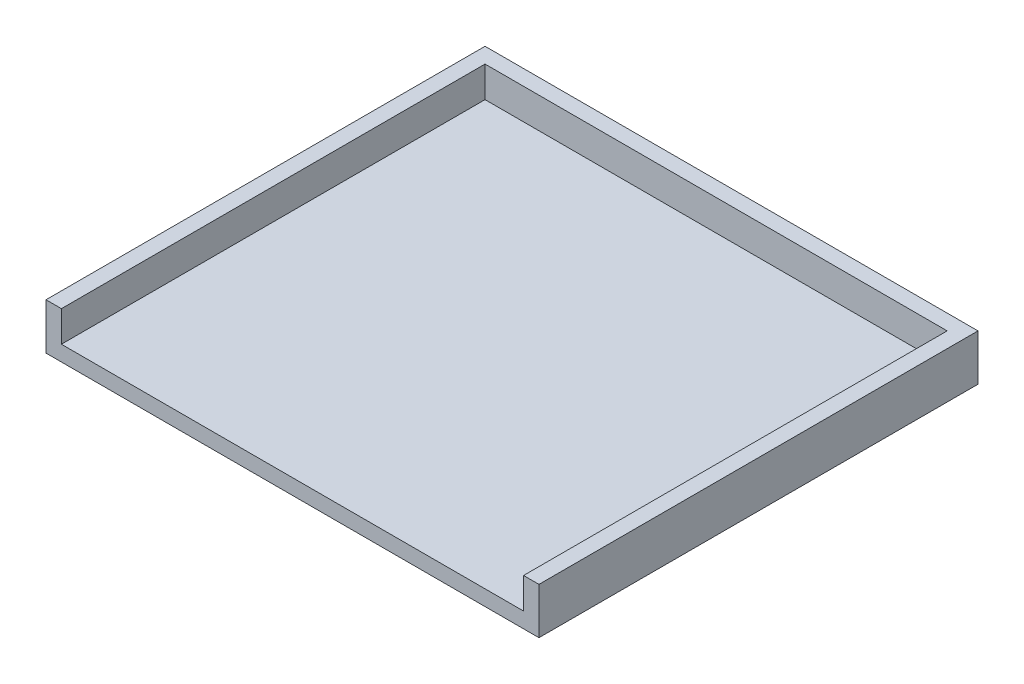
ISO-10303-21;
HEADER;
FILE_DESCRIPTION(('STEP AP214'),'2;1');
FILE_NAME('part.step','',(''),(''),'','','');
FILE_SCHEMA(('AUTOMOTIVE_DESIGN { 1 0 10303 214 1 1 1 1 }'));
ENDSEC;
DATA;
#1=APPLICATION_CONTEXT('core data for automotive mechanical design processes');
#2=APPLICATION_PROTOCOL_DEFINITION('international standard','automotive_design',2000,#1);
#3=PRODUCT_CONTEXT('',#1,'mechanical');
#4=PRODUCT('Part','Part','',(#3));
#5=PRODUCT_RELATED_PRODUCT_CATEGORY('part','',(#4));
#6=PRODUCT_DEFINITION_FORMATION('','',#4);
#7=PRODUCT_DEFINITION_CONTEXT('part definition',#1,'design');
#8=PRODUCT_DEFINITION('design','',#6,#7);
#9=PRODUCT_DEFINITION_SHAPE('','',#8);
#10=(LENGTH_UNIT() NAMED_UNIT(*) SI_UNIT(.MILLI.,.METRE.));
#11=(NAMED_UNIT(*) PLANE_ANGLE_UNIT() SI_UNIT($,.RADIAN.));
#12=(NAMED_UNIT(*) SI_UNIT($,.STERADIAN.) SOLID_ANGLE_UNIT());
#13=UNCERTAINTY_MEASURE_WITH_UNIT(LENGTH_MEASURE(1.E-05),#10,'distance_accuracy_value','');
#14=(GEOMETRIC_REPRESENTATION_CONTEXT(3) GLOBAL_UNCERTAINTY_ASSIGNED_CONTEXT((#13)) GLOBAL_UNIT_ASSIGNED_CONTEXT((#10,
#11,#12)) REPRESENTATION_CONTEXT('',''));
#15=CARTESIAN_POINT('',(0.,0.,0.));
#16=DIRECTION('',(0.,0.,1.));
#17=DIRECTION('',(1.,0.,0.));
#18=AXIS2_PLACEMENT_3D('',#15,#16,#17);
#19=CARTESIAN_POINT('',(0.,40.,0.));
#20=DIRECTION('',(0.,1.,0.));
#21=DIRECTION('',(0.,0.,1.));
#22=AXIS2_PLACEMENT_3D('',#19,#20,#21);
#23=PLANE('',#22);
#24=DIRECTION('',(0.,0.,1.));
#25=VECTOR('',#24,1.);
#26=CARTESIAN_POINT('',(1240.,40.,0.));
#27=LINE('',#26,#25);
#28=CARTESIAN_POINT('',(1240.,40.,40.0000000000001));
#29=VERTEX_POINT('',#28);
#30=CARTESIAN_POINT('',(1240.,40.,1140.));
#31=VERTEX_POINT('',#30);
#32=EDGE_CURVE('E135',#29,#31,#27,.T.);
#33=ORIENTED_EDGE('',*,*,#32,.F.);
#34=DIRECTION('',(1.,0.,0.));
#35=VECTOR('',#34,1.);
#36=CARTESIAN_POINT('',(40.,40.,40.0000000000001));
#37=LINE('',#36,#35);
#38=CARTESIAN_POINT('',(40.,40.,40.0000000000001));
#39=VERTEX_POINT('',#38);
#40=EDGE_CURVE('E119',#39,#29,#37,.T.);
#41=ORIENTED_EDGE('',*,*,#40,.F.);
#42=DIRECTION('',(0.,0.,-1.));
#43=VECTOR('',#42,1.);
#44=CARTESIAN_POINT('',(40.,40.,1.2176416873608E-13));
#45=LINE('',#44,#43);
#46=CARTESIAN_POINT('',(40.,40.,1140.));
#47=VERTEX_POINT('',#46);
#48=EDGE_CURVE('E123',#47,#39,#45,.T.);
#49=ORIENTED_EDGE('',*,*,#48,.F.);
#50=DIRECTION('',(1.,0.,0.));
#51=VECTOR('',#50,1.);
#52=CARTESIAN_POINT('',(0.,40.,1140.));
#53=LINE('',#52,#51);
#54=EDGE_CURVE('E163',#47,#31,#53,.T.);
#55=ORIENTED_EDGE('',*,*,#54,.T.);
#56=EDGE_LOOP('',(#33,#41,#49,#55));
#57=FACE_BOUND('',#56,.T.);
#58=ADVANCED_FACE('F39',(#57),#23,.T.);
#59=CARTESIAN_POINT('',(1240.,120.,0.));
#60=DIRECTION('',(1.,0.,0.));
#61=DIRECTION('',(0.,0.,-1.));
#62=AXIS2_PLACEMENT_3D('',#59,#60,#61);
#63=PLANE('',#62);
#64=DIRECTION('',(0.,-1.,0.));
#65=VECTOR('',#64,1.);
#66=CARTESIAN_POINT('',(1240.,120.,40.0000000000001));
#67=LINE('',#66,#65);
#68=CARTESIAN_POINT('',(1240.,120.,40.0000000000001));
#69=VERTEX_POINT('',#68);
#70=EDGE_CURVE('E114',#69,#29,#67,.T.);
#71=ORIENTED_EDGE('',*,*,#70,.T.);
#72=ORIENTED_EDGE('',*,*,#32,.T.);
#73=DIRECTION('',(0.,-1.,0.));
#74=VECTOR('',#73,1.);
#75=CARTESIAN_POINT('',(1240.,120.,1140.));
#76=LINE('',#75,#74);
#77=CARTESIAN_POINT('',(1240.,120.,1140.));
#78=VERTEX_POINT('',#77);
#79=EDGE_CURVE('E156',#78,#31,#76,.T.);
#80=ORIENTED_EDGE('',*,*,#79,.F.);
#81=DIRECTION('',(0.,0.,1.));
#82=VECTOR('',#81,1.);
#83=CARTESIAN_POINT('',(1240.,120.,0.));
#84=LINE('',#83,#82);
#85=EDGE_CURVE('E149',#69,#78,#84,.T.);
#86=ORIENTED_EDGE('',*,*,#85,.F.);
#87=EDGE_LOOP('',(#71,#72,#80,#86));
#88=FACE_BOUND('',#87,.T.);
#89=ADVANCED_FACE('F202',(#88),#63,.F.);
#90=CARTESIAN_POINT('',(40.,120.,1.2176416873608E-13));
#91=DIRECTION('',(-1.,0.,0.));
#92=DIRECTION('',(0.,0.,1.));
#93=AXIS2_PLACEMENT_3D('',#90,#91,#92);
#94=PLANE('',#93);
#95=DIRECTION('',(0.,-1.,0.));
#96=VECTOR('',#95,1.);
#97=CARTESIAN_POINT('',(40.,120.,40.0000000000001));
#98=LINE('',#97,#96);
#99=CARTESIAN_POINT('',(40.,120.,40.0000000000001));
#100=VERTEX_POINT('',#99);
#101=EDGE_CURVE('E111',#100,#39,#98,.T.);
#102=ORIENTED_EDGE('',*,*,#101,.F.);
#103=DIRECTION('',(0.,0.,-1.));
#104=VECTOR('',#103,1.);
#105=CARTESIAN_POINT('',(40.,120.,1.2176416873608E-13));
#106=LINE('',#105,#104);
#107=CARTESIAN_POINT('',(40.,120.,1140.));
#108=VERTEX_POINT('',#107);
#109=EDGE_CURVE('E122',#108,#100,#106,.T.);
#110=ORIENTED_EDGE('',*,*,#109,.F.);
#111=DIRECTION('',(0.,-1.,0.));
#112=VECTOR('',#111,1.);
#113=CARTESIAN_POINT('',(40.,120.,1140.));
#114=LINE('',#113,#112);
#115=EDGE_CURVE('E55',#108,#47,#114,.T.);
#116=ORIENTED_EDGE('',*,*,#115,.T.);
#117=ORIENTED_EDGE('',*,*,#48,.T.);
#118=EDGE_LOOP('',(#102,#110,#116,#117));
#119=FACE_BOUND('',#118,.T.);
#120=ADVANCED_FACE('F121',(#119),#94,.F.);
#121=CARTESIAN_POINT('',(0.,40.,0.));
#122=DIRECTION('',(1.,0.,0.));
#123=DIRECTION('',(0.,0.,-1.));
#124=AXIS2_PLACEMENT_3D('',#121,#122,#123);
#125=PLANE('',#124);
#126=DIRECTION('',(0.,0.,1.));
#127=VECTOR('',#126,1.);
#128=CARTESIAN_POINT('',(0.,0.,0.));
#129=LINE('',#128,#127);
#130=CARTESIAN_POINT('',(0.,0.,0.));
#131=VERTEX_POINT('',#130);
#132=CARTESIAN_POINT('',(0.,0.,1140.));
#133=VERTEX_POINT('',#132);
#134=EDGE_CURVE('E162',#131,#133,#129,.T.);
#135=ORIENTED_EDGE('',*,*,#134,.T.);
#136=DIRECTION('',(0.,-1.,0.));
#137=VECTOR('',#136,1.);
#138=CARTESIAN_POINT('',(0.,40.,1140.));
#139=LINE('',#138,#137);
#140=CARTESIAN_POINT('',(2.22044604925031E-13,120.,1140.));
#141=VERTEX_POINT('',#140);
#142=EDGE_CURVE('E11',#141,#133,#139,.T.);
#143=ORIENTED_EDGE('',*,*,#142,.F.);
#144=DIRECTION('',(0.,0.,1.));
#145=VECTOR('',#144,1.);
#146=CARTESIAN_POINT('',(0.,120.,1.2465662030879E-13));
#147=LINE('',#146,#145);
#148=CARTESIAN_POINT('',(0.,120.,1.2465662030879E-13));
#149=VERTEX_POINT('',#148);
#150=EDGE_CURVE('E137',#149,#141,#147,.T.);
#151=ORIENTED_EDGE('',*,*,#150,.F.);
#152=DIRECTION('',(0.,-1.,0.));
#153=VECTOR('',#152,1.);
#154=CARTESIAN_POINT('',(0.,40.,0.));
#155=LINE('',#154,#153);
#156=EDGE_CURVE('E167',#149,#131,#155,.T.);
#157=ORIENTED_EDGE('',*,*,#156,.T.);
#158=EDGE_LOOP('',(#135,#143,#151,#157));
#159=FACE_BOUND('',#158,.T.);
#160=ADVANCED_FACE('F41',(#159),#125,.F.);
#161=CARTESIAN_POINT('',(0.,40.,1140.));
#162=DIRECTION('',(0.,0.,-1.));
#163=DIRECTION('',(-1.,0.,0.));
#164=AXIS2_PLACEMENT_3D('',#161,#162,#163);
#165=PLANE('',#164);
#166=DIRECTION('',(1.,0.,0.));
#167=VECTOR('',#166,1.);
#168=CARTESIAN_POINT('',(0.,0.,1140.));
#169=LINE('',#168,#167);
#170=CARTESIAN_POINT('',(1280.,0.,1140.));
#171=VERTEX_POINT('',#170);
#172=EDGE_CURVE('E171',#133,#171,#169,.T.);
#173=ORIENTED_EDGE('',*,*,#172,.T.);
#174=DIRECTION('',(0.,-1.,0.));
#175=VECTOR('',#174,1.);
#176=CARTESIAN_POINT('',(1280.,40.,1140.));
#177=LINE('',#176,#175);
#178=CARTESIAN_POINT('',(1280.,120.,1140.));
#179=VERTEX_POINT('',#178);
#180=EDGE_CURVE('E48',#179,#171,#177,.T.);
#181=ORIENTED_EDGE('',*,*,#180,.F.);
#182=DIRECTION('',(1.,0.,0.));
#183=VECTOR('',#182,1.);
#184=CARTESIAN_POINT('',(1280.,120.,1140.));
#185=LINE('',#184,#183);
#186=EDGE_CURVE('E152',#78,#179,#185,.T.);
#187=ORIENTED_EDGE('',*,*,#186,.F.);
#188=ORIENTED_EDGE('',*,*,#79,.T.);
#189=ORIENTED_EDGE('',*,*,#54,.F.);
#190=ORIENTED_EDGE('',*,*,#115,.F.);
#191=DIRECTION('',(1.,0.,0.));
#192=VECTOR('',#191,1.);
#193=CARTESIAN_POINT('',(2.22044604925031E-13,120.,1140.));
#194=LINE('',#193,#192);
#195=EDGE_CURVE('E130',#141,#108,#194,.T.);
#196=ORIENTED_EDGE('',*,*,#195,.F.);
#197=ORIENTED_EDGE('',*,*,#142,.T.);
#198=EDGE_LOOP('',(#173,#181,#187,#188,#189,#190,#196,#197));
#199=FACE_BOUND('',#198,.T.);
#200=ADVANCED_FACE('F199',(#199),#165,.F.);
#201=CARTESIAN_POINT('',(1280.,40.,0.));
#202=DIRECTION('',(-1.,0.,0.));
#203=DIRECTION('',(0.,0.,1.));
#204=AXIS2_PLACEMENT_3D('',#201,#202,#203);
#205=PLANE('',#204);
#206=DIRECTION('',(0.,0.,-1.));
#207=VECTOR('',#206,1.);
#208=CARTESIAN_POINT('',(1280.,0.,0.));
#209=LINE('',#208,#207);
#210=CARTESIAN_POINT('',(1280.,0.,0.));
#211=VERTEX_POINT('',#210);
#212=EDGE_CURVE('E174',#171,#211,#209,.T.);
#213=ORIENTED_EDGE('',*,*,#212,.T.);
#214=DIRECTION('',(0.,-1.,0.));
#215=VECTOR('',#214,1.);
#216=CARTESIAN_POINT('',(1280.,40.,0.));
#217=LINE('',#216,#215);
#218=CARTESIAN_POINT('',(1280.,120.,0.));
#219=VERTEX_POINT('',#218);
#220=EDGE_CURVE('E181',#219,#211,#217,.T.);
#221=ORIENTED_EDGE('',*,*,#220,.F.);
#222=DIRECTION('',(0.,0.,-1.));
#223=VECTOR('',#222,1.);
#224=CARTESIAN_POINT('',(1280.,120.,0.));
#225=LINE('',#224,#223);
#226=EDGE_CURVE('E143',#179,#219,#225,.T.);
#227=ORIENTED_EDGE('',*,*,#226,.F.);
#228=ORIENTED_EDGE('',*,*,#180,.T.);
#229=EDGE_LOOP('',(#213,#221,#227,#228));
#230=FACE_BOUND('',#229,.T.);
#231=ADVANCED_FACE('F188',(#230),#205,.F.);
#232=CARTESIAN_POINT('',(0.,40.,0.));
#233=DIRECTION('',(0.,0.,1.));
#234=DIRECTION('',(1.,0.,0.));
#235=AXIS2_PLACEMENT_3D('',#232,#233,#234);
#236=PLANE('',#235);
#237=DIRECTION('',(-1.,0.,0.));
#238=VECTOR('',#237,1.);
#239=CARTESIAN_POINT('',(0.,0.,0.));
#240=LINE('',#239,#238);
#241=EDGE_CURVE('E63',#211,#131,#240,.T.);
#242=ORIENTED_EDGE('',*,*,#241,.T.);
#243=ORIENTED_EDGE('',*,*,#156,.F.);
#244=DIRECTION('',(-1.,0.,0.));
#245=VECTOR('',#244,1.);
#246=CARTESIAN_POINT('',(1280.,120.,0.));
#247=LINE('',#246,#245);
#248=EDGE_CURVE('E146',#219,#149,#247,.T.);
#249=ORIENTED_EDGE('',*,*,#248,.F.);
#250=ORIENTED_EDGE('',*,*,#220,.T.);
#251=EDGE_LOOP('',(#242,#243,#249,#250));
#252=FACE_BOUND('',#251,.T.);
#253=ADVANCED_FACE('F197',(#252),#236,.F.);
#254=CARTESIAN_POINT('',(0.,0.,0.));
#255=DIRECTION('',(0.,1.,0.));
#256=DIRECTION('',(0.,0.,1.));
#257=AXIS2_PLACEMENT_3D('',#254,#255,#256);
#258=PLANE('',#257);
#259=ORIENTED_EDGE('',*,*,#134,.F.);
#260=ORIENTED_EDGE('',*,*,#241,.F.);
#261=ORIENTED_EDGE('',*,*,#212,.F.);
#262=ORIENTED_EDGE('',*,*,#172,.F.);
#263=EDGE_LOOP('',(#259,#260,#261,#262));
#264=FACE_BOUND('',#263,.T.);
#265=ADVANCED_FACE('F193',(#264),#258,.F.);
#266=CARTESIAN_POINT('',(0.,120.,0.));
#267=DIRECTION('',(0.,-1.,0.));
#268=DIRECTION('',(0.,0.,-1.));
#269=AXIS2_PLACEMENT_3D('',#266,#267,#268);
#270=PLANE('',#269);
#271=ORIENTED_EDGE('',*,*,#226,.T.);
#272=ORIENTED_EDGE('',*,*,#248,.T.);
#273=ORIENTED_EDGE('',*,*,#150,.T.);
#274=ORIENTED_EDGE('',*,*,#195,.T.);
#275=ORIENTED_EDGE('',*,*,#109,.T.);
#276=DIRECTION('',(1.,0.,0.));
#277=VECTOR('',#276,1.);
#278=CARTESIAN_POINT('',(40.,120.,40.0000000000001));
#279=LINE('',#278,#277);
#280=EDGE_CURVE('E108',#100,#69,#279,.T.);
#281=ORIENTED_EDGE('',*,*,#280,.T.);
#282=ORIENTED_EDGE('',*,*,#85,.T.);
#283=ORIENTED_EDGE('',*,*,#186,.T.);
#284=EDGE_LOOP('',(#271,#272,#273,#274,#275,#281,#282,#283));
#285=FACE_BOUND('',#284,.T.);
#286=ADVANCED_FACE('F127',(#285),#270,.F.);
#287=CARTESIAN_POINT('',(40.,120.,40.0000000000001));
#288=DIRECTION('',(0.,0.,-1.));
#289=DIRECTION('',(-1.,0.,0.));
#290=AXIS2_PLACEMENT_3D('',#287,#288,#289);
#291=PLANE('',#290);
#292=ORIENTED_EDGE('',*,*,#40,.T.);
#293=ORIENTED_EDGE('',*,*,#70,.F.);
#294=ORIENTED_EDGE('',*,*,#280,.F.);
#295=ORIENTED_EDGE('',*,*,#101,.T.);
#296=EDGE_LOOP('',(#292,#293,#294,#295));
#297=FACE_BOUND('',#296,.T.);
#298=ADVANCED_FACE('F110',(#297),#291,.F.);
#299=CLOSED_SHELL('',(#58,#89,#120,#160,#200,#231,#253,#265,#286,#298));
#300=MANIFOLD_SOLID_BREP('B2',#299);
#301=ADVANCED_BREP_SHAPE_REPRESENTATION('',(#18,#300),#14);
#302=SHAPE_DEFINITION_REPRESENTATION(#9,#301);
ENDSEC;
END-ISO-10303-21;
